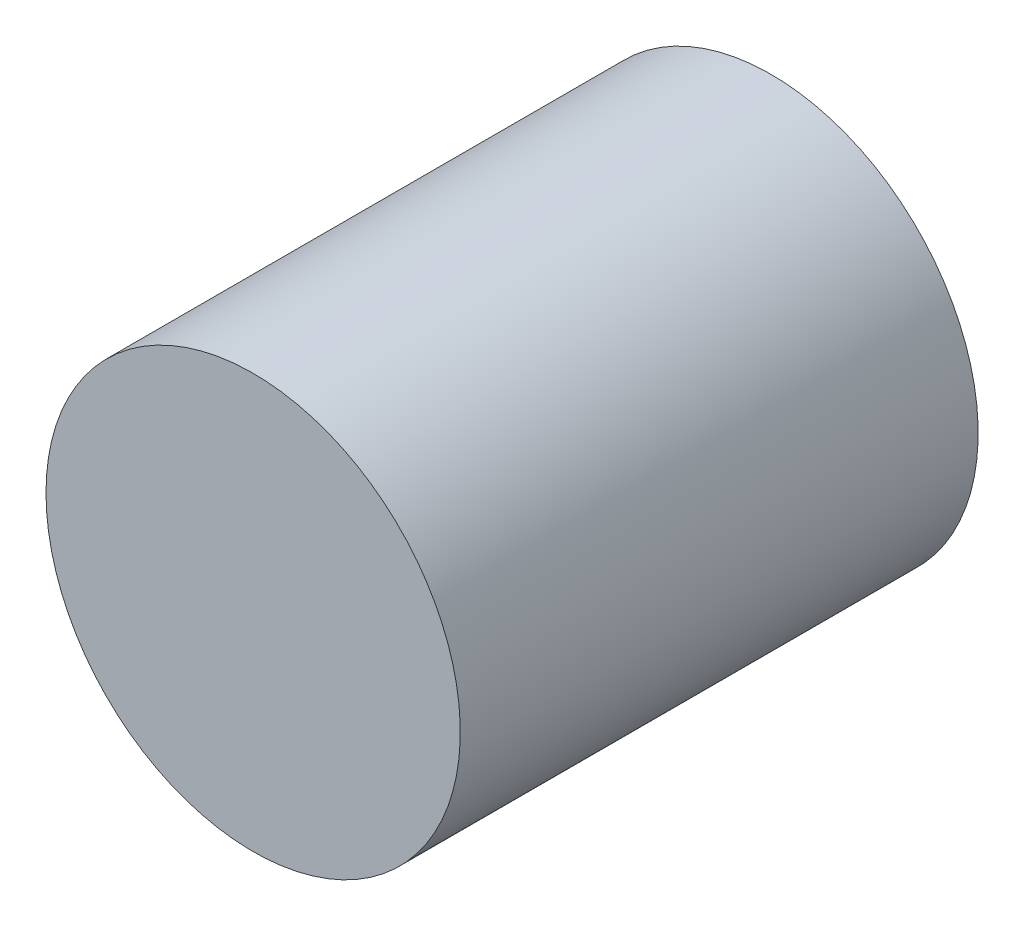
ISO-10303-21;
HEADER;
FILE_DESCRIPTION(('STEP AP214'),'2;1');
FILE_NAME('part.step','',(''),(''),'','','');
FILE_SCHEMA(('AUTOMOTIVE_DESIGN { 1 0 10303 214 1 1 1 1 }'));
ENDSEC;
DATA;
#1=APPLICATION_CONTEXT('core data for automotive mechanical design processes');
#2=APPLICATION_PROTOCOL_DEFINITION('international standard','automotive_design',2000,#1);
#3=PRODUCT_CONTEXT('',#1,'mechanical');
#4=PRODUCT('Part','Part','',(#3));
#5=PRODUCT_RELATED_PRODUCT_CATEGORY('part','',(#4));
#6=PRODUCT_DEFINITION_FORMATION('','',#4);
#7=PRODUCT_DEFINITION_CONTEXT('part definition',#1,'design');
#8=PRODUCT_DEFINITION('design','',#6,#7);
#9=PRODUCT_DEFINITION_SHAPE('','',#8);
#10=(LENGTH_UNIT() NAMED_UNIT(*) SI_UNIT(.MILLI.,.METRE.));
#11=(NAMED_UNIT(*) PLANE_ANGLE_UNIT() SI_UNIT($,.RADIAN.));
#12=(NAMED_UNIT(*) SI_UNIT($,.STERADIAN.) SOLID_ANGLE_UNIT());
#13=UNCERTAINTY_MEASURE_WITH_UNIT(LENGTH_MEASURE(1.E-05),#10,'distance_accuracy_value','');
#14=(GEOMETRIC_REPRESENTATION_CONTEXT(3) GLOBAL_UNCERTAINTY_ASSIGNED_CONTEXT((#13)) GLOBAL_UNIT_ASSIGNED_CONTEXT((#10,
#11,#12)) REPRESENTATION_CONTEXT('',''));
#15=CARTESIAN_POINT('',(0.,0.,0.));
#16=DIRECTION('',(0.,0.,1.));
#17=DIRECTION('',(1.,0.,0.));
#18=AXIS2_PLACEMENT_3D('',#15,#16,#17);
#19=CARTESIAN_POINT('',(0.3999992,0.,0.));
#20=DIRECTION('',(0.,0.,-1.));
#21=DIRECTION('',(-1.,0.,0.));
#22=AXIS2_PLACEMENT_3D('',#19,#20,#21);
#23=PLANE('',#22);
#24=CARTESIAN_POINT('',(0.,0.,0.));
#25=DIRECTION('',(0.,0.,-1.));
#26=DIRECTION('',(-1.,0.,0.));
#27=AXIS2_PLACEMENT_3D('',#24,#25,#26);
#28=CIRCLE('',#27,0.3999992);
#29=CARTESIAN_POINT('',(-0.3999992,0.,0.));
#30=VERTEX_POINT('',#29);
#31=EDGE_CURVE('E18',#30,#30,#28,.F.);
#32=ORIENTED_EDGE('',*,*,#31,.F.);
#33=EDGE_LOOP('',(#32));
#34=FACE_BOUND('',#33,.T.);
#35=ADVANCED_FACE('F15',(#34),#23,.T.);
#36=CARTESIAN_POINT('',(0.3999992,0.,1.00000054));
#37=DIRECTION('',(0.,0.,-1.));
#38=DIRECTION('',(-1.,0.,0.));
#39=AXIS2_PLACEMENT_3D('',#36,#37,#38);
#40=PLANE('',#39);
#41=CARTESIAN_POINT('',(0.,0.,1.00000054));
#42=DIRECTION('',(0.,0.,-1.));
#43=DIRECTION('',(-1.,0.,0.));
#44=AXIS2_PLACEMENT_3D('',#41,#42,#43);
#45=CIRCLE('',#44,0.3999992);
#46=CARTESIAN_POINT('',(-0.3999992,0.,1.00000054));
#47=VERTEX_POINT('',#46);
#48=EDGE_CURVE('E10',#47,#47,#45,.T.);
#49=ORIENTED_EDGE('',*,*,#48,.F.);
#50=EDGE_LOOP('',(#49));
#51=FACE_BOUND('',#50,.T.);
#52=ADVANCED_FACE('F30',(#51),#40,.F.);
#53=CARTESIAN_POINT('',(0.,0.,0.));
#54=DIRECTION('',(0.,0.,-1.));
#55=DIRECTION('',(-1.,0.,0.));
#56=AXIS2_PLACEMENT_3D('',#53,#54,#55);
#57=CYLINDRICAL_SURFACE('',#56,0.3999992);
#58=ORIENTED_EDGE('',*,*,#48,.T.);
#59=EDGE_LOOP('',(#58));
#60=FACE_BOUND('',#59,.T.);
#61=ORIENTED_EDGE('',*,*,#31,.T.);
#62=EDGE_LOOP('',(#61));
#63=FACE_BOUND('',#62,.T.);
#64=ADVANCED_FACE('F27',(#60,#63),#57,.T.);
#65=CLOSED_SHELL('',(#35,#52,#64));
#66=MANIFOLD_SOLID_BREP('B1',#65);
#67=ADVANCED_BREP_SHAPE_REPRESENTATION('',(#18,#66),#14);
#68=SHAPE_DEFINITION_REPRESENTATION(#9,#67);
ENDSEC;
END-ISO-10303-21;
